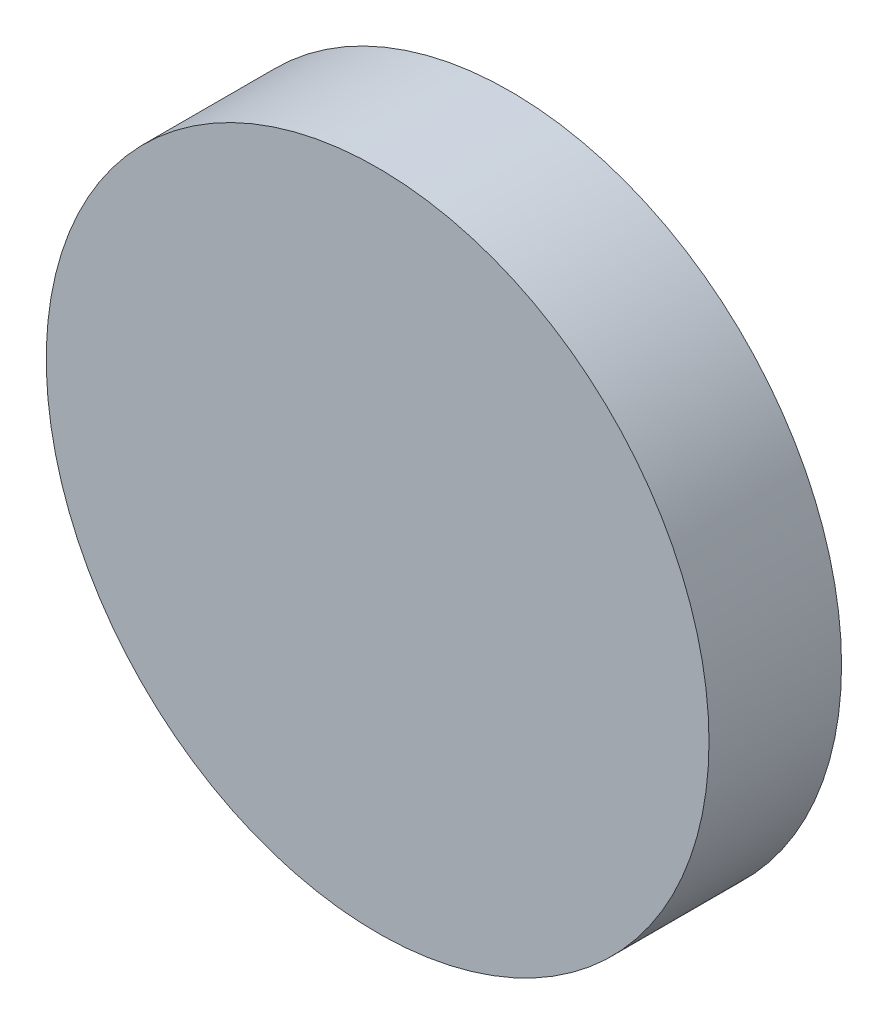
ISO-10303-21;
HEADER;
FILE_DESCRIPTION(('STEP AP214'),'2;1');
FILE_NAME('part.step','',(''),(''),'','','');
FILE_SCHEMA(('AUTOMOTIVE_DESIGN { 1 0 10303 214 1 1 1 1 }'));
ENDSEC;
DATA;
#1=APPLICATION_CONTEXT('core data for automotive mechanical design processes');
#2=APPLICATION_PROTOCOL_DEFINITION('international standard','automotive_design',2000,#1);
#3=PRODUCT_CONTEXT('',#1,'mechanical');
#4=PRODUCT('Part','Part','',(#3));
#5=PRODUCT_RELATED_PRODUCT_CATEGORY('part','',(#4));
#6=PRODUCT_DEFINITION_FORMATION('','',#4);
#7=PRODUCT_DEFINITION_CONTEXT('part definition',#1,'design');
#8=PRODUCT_DEFINITION('design','',#6,#7);
#9=PRODUCT_DEFINITION_SHAPE('','',#8);
#10=(LENGTH_UNIT() NAMED_UNIT(*) SI_UNIT(.MILLI.,.METRE.));
#11=(NAMED_UNIT(*) PLANE_ANGLE_UNIT() SI_UNIT($,.RADIAN.));
#12=(NAMED_UNIT(*) SI_UNIT($,.STERADIAN.) SOLID_ANGLE_UNIT());
#13=UNCERTAINTY_MEASURE_WITH_UNIT(LENGTH_MEASURE(1.E-05),#10,'distance_accuracy_value','');
#14=(GEOMETRIC_REPRESENTATION_CONTEXT(3) GLOBAL_UNCERTAINTY_ASSIGNED_CONTEXT((#13)) GLOBAL_UNIT_ASSIGNED_CONTEXT((#10,
#11,#12)) REPRESENTATION_CONTEXT('',''));
#15=CARTESIAN_POINT('',(0.,0.,0.));
#16=DIRECTION('',(0.,0.,1.));
#17=DIRECTION('',(1.,0.,0.));
#18=AXIS2_PLACEMENT_3D('',#15,#16,#17);
#19=CARTESIAN_POINT('',(0.,0.,2.54));
#20=DIRECTION('',(0.,0.,-1.));
#21=DIRECTION('',(-1.,0.,0.));
#22=AXIS2_PLACEMENT_3D('',#19,#20,#21);
#23=CYLINDRICAL_SURFACE('',#22,6.35);
#24=CARTESIAN_POINT('',(0.,0.,2.54));
#25=DIRECTION('',(0.,0.,1.));
#26=DIRECTION('',(1.,0.,0.));
#27=AXIS2_PLACEMENT_3D('',#24,#25,#26);
#28=CIRCLE('',#27,6.35);
#29=CARTESIAN_POINT('',(6.35,0.,2.54));
#30=VERTEX_POINT('',#29);
#31=EDGE_CURVE('E10',#30,#30,#28,.T.);
#32=ORIENTED_EDGE('',*,*,#31,.F.);
#33=EDGE_LOOP('',(#32));
#34=FACE_BOUND('',#33,.T.);
#35=CARTESIAN_POINT('',(0.,0.,0.));
#36=DIRECTION('',(0.,0.,1.));
#37=DIRECTION('',(1.,0.,0.));
#38=AXIS2_PLACEMENT_3D('',#35,#36,#37);
#39=CIRCLE('',#38,6.35);
#40=CARTESIAN_POINT('',(6.35,0.,0.));
#41=VERTEX_POINT('',#40);
#42=EDGE_CURVE('E37',#41,#41,#39,.T.);
#43=ORIENTED_EDGE('',*,*,#42,.T.);
#44=EDGE_LOOP('',(#43));
#45=FACE_BOUND('',#44,.T.);
#46=ADVANCED_FACE('F34',(#34,#45),#23,.T.);
#47=CARTESIAN_POINT('',(0.,0.,2.54));
#48=DIRECTION('',(0.,0.,1.));
#49=DIRECTION('',(1.,0.,0.));
#50=AXIS2_PLACEMENT_3D('',#47,#48,#49);
#51=PLANE('',#50);
#52=ORIENTED_EDGE('',*,*,#31,.T.);
#53=EDGE_LOOP('',(#52));
#54=FACE_BOUND('',#53,.T.);
#55=ADVANCED_FACE('F49',(#54),#51,.T.);
#56=CARTESIAN_POINT('',(0.,0.,0.));
#57=DIRECTION('',(0.,0.,1.));
#58=DIRECTION('',(1.,0.,0.));
#59=AXIS2_PLACEMENT_3D('',#56,#57,#58);
#60=PLANE('',#59);
#61=ORIENTED_EDGE('',*,*,#42,.F.);
#62=EDGE_LOOP('',(#61));
#63=FACE_BOUND('',#62,.T.);
#64=ADVANCED_FACE('F47',(#63),#60,.F.);
#65=CLOSED_SHELL('',(#46,#55,#64));
#66=MANIFOLD_SOLID_BREP('B2',#65);
#67=ADVANCED_BREP_SHAPE_REPRESENTATION('',(#18,#66),#14);
#68=SHAPE_DEFINITION_REPRESENTATION(#9,#67);
ENDSEC;
END-ISO-10303-21;
